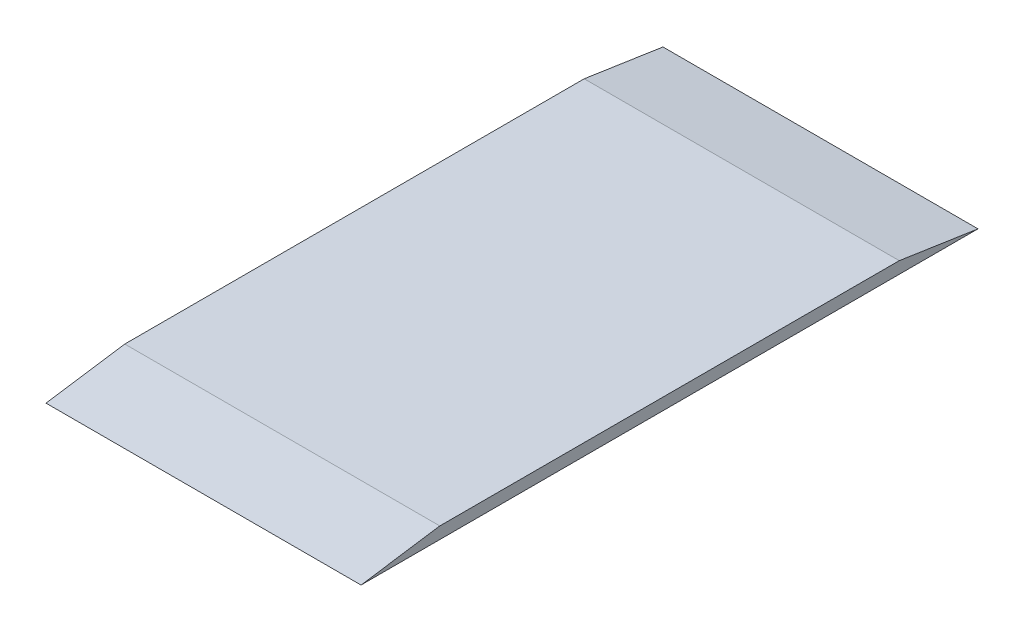
ISO-10303-21;
HEADER;
FILE_DESCRIPTION(('STEP AP214'),'2;1');
FILE_NAME('part.step','',(''),(''),'','','');
FILE_SCHEMA(('AUTOMOTIVE_DESIGN { 1 0 10303 214 1 1 1 1 }'));
ENDSEC;
DATA;
#1=APPLICATION_CONTEXT('core data for automotive mechanical design processes');
#2=APPLICATION_PROTOCOL_DEFINITION('international standard','automotive_design',2000,#1);
#3=PRODUCT_CONTEXT('',#1,'mechanical');
#4=PRODUCT('Part','Part','',(#3));
#5=PRODUCT_RELATED_PRODUCT_CATEGORY('part','',(#4));
#6=PRODUCT_DEFINITION_FORMATION('','',#4);
#7=PRODUCT_DEFINITION_CONTEXT('part definition',#1,'design');
#8=PRODUCT_DEFINITION('design','',#6,#7);
#9=PRODUCT_DEFINITION_SHAPE('','',#8);
#10=(LENGTH_UNIT() NAMED_UNIT(*) SI_UNIT(.MILLI.,.METRE.));
#11=(NAMED_UNIT(*) PLANE_ANGLE_UNIT() SI_UNIT($,.RADIAN.));
#12=(NAMED_UNIT(*) SI_UNIT($,.STERADIAN.) SOLID_ANGLE_UNIT());
#13=UNCERTAINTY_MEASURE_WITH_UNIT(LENGTH_MEASURE(1.E-05),#10,'distance_accuracy_value','');
#14=(GEOMETRIC_REPRESENTATION_CONTEXT(3) GLOBAL_UNCERTAINTY_ASSIGNED_CONTEXT((#13)) GLOBAL_UNIT_ASSIGNED_CONTEXT((#10,
#11,#12)) REPRESENTATION_CONTEXT('',''));
#15=CARTESIAN_POINT('',(0.,0.,0.));
#16=DIRECTION('',(0.,0.,1.));
#17=DIRECTION('',(1.,0.,0.));
#18=AXIS2_PLACEMENT_3D('',#15,#16,#17);
#19=CARTESIAN_POINT('',(12.,0.9,-17.5));
#20=DIRECTION('',(0.,-0.988936352868298,0.148340452930245));
#21=DIRECTION('',(0.,-0.148340452930245,-0.988936352868298));
#22=AXIS2_PLACEMENT_3D('',#19,#20,#21);
#23=PLANE('',#22);
#24=DIRECTION('',(0.,0.148340452930245,0.988936352868297));
#25=VECTOR('',#24,1.);
#26=CARTESIAN_POINT('',(-12.,0.9,-17.5));
#27=LINE('',#26,#25);
#28=CARTESIAN_POINT('',(-12.,0.,-23.5));
#29=VERTEX_POINT('',#28);
#30=CARTESIAN_POINT('',(-12.,0.9,-17.5));
#31=VERTEX_POINT('',#30);
#32=EDGE_CURVE('E100',#29,#31,#27,.T.);
#33=ORIENTED_EDGE('',*,*,#32,.T.);
#34=DIRECTION('',(-1.,0.,0.));
#35=VECTOR('',#34,1.);
#36=CARTESIAN_POINT('',(12.,0.9,-17.5));
#37=LINE('',#36,#35);
#38=CARTESIAN_POINT('',(12.,0.9,-17.5));
#39=VERTEX_POINT('',#38);
#40=EDGE_CURVE('E11',#39,#31,#37,.T.);
#41=ORIENTED_EDGE('',*,*,#40,.F.);
#42=DIRECTION('',(0.,0.148340452930245,0.988936352868297));
#43=VECTOR('',#42,1.);
#44=CARTESIAN_POINT('',(12.,0.9,-17.5));
#45=LINE('',#44,#43);
#46=CARTESIAN_POINT('',(12.,0.,-23.5));
#47=VERTEX_POINT('',#46);
#48=EDGE_CURVE('E88',#47,#39,#45,.T.);
#49=ORIENTED_EDGE('',*,*,#48,.F.);
#50=DIRECTION('',(-1.,0.,0.));
#51=VECTOR('',#50,1.);
#52=CARTESIAN_POINT('',(12.,0.,-23.5));
#53=LINE('',#52,#51);
#54=EDGE_CURVE('E96',#47,#29,#53,.T.);
#55=ORIENTED_EDGE('',*,*,#54,.T.);
#56=EDGE_LOOP('',(#33,#41,#49,#55));
#57=FACE_BOUND('',#56,.T.);
#58=ADVANCED_FACE('F37',(#57),#23,.F.);
#59=CARTESIAN_POINT('',(12.,0.9,17.5));
#60=DIRECTION('',(0.,-1.,0.));
#61=DIRECTION('',(0.,0.,-1.));
#62=AXIS2_PLACEMENT_3D('',#59,#60,#61);
#63=PLANE('',#62);
#64=DIRECTION('',(0.,0.,1.));
#65=VECTOR('',#64,1.);
#66=CARTESIAN_POINT('',(-12.,0.9,17.5));
#67=LINE('',#66,#65);
#68=CARTESIAN_POINT('',(-12.,0.9,17.5));
#69=VERTEX_POINT('',#68);
#70=EDGE_CURVE('E92',#31,#69,#67,.T.);
#71=ORIENTED_EDGE('',*,*,#70,.T.);
#72=DIRECTION('',(-1.,0.,0.));
#73=VECTOR('',#72,1.);
#74=CARTESIAN_POINT('',(12.,0.9,17.5));
#75=LINE('',#74,#73);
#76=CARTESIAN_POINT('',(12.,0.9,17.5));
#77=VERTEX_POINT('',#76);
#78=EDGE_CURVE('E45',#77,#69,#75,.T.);
#79=ORIENTED_EDGE('',*,*,#78,.F.);
#80=DIRECTION('',(0.,0.,1.));
#81=VECTOR('',#80,1.);
#82=CARTESIAN_POINT('',(12.,0.9,17.5));
#83=LINE('',#82,#81);
#84=EDGE_CURVE('E83',#39,#77,#83,.T.);
#85=ORIENTED_EDGE('',*,*,#84,.F.);
#86=ORIENTED_EDGE('',*,*,#40,.T.);
#87=EDGE_LOOP('',(#71,#79,#85,#86));
#88=FACE_BOUND('',#87,.T.);
#89=ADVANCED_FACE('F91',(#88),#63,.F.);
#90=CARTESIAN_POINT('',(12.,0.,23.5));
#91=DIRECTION('',(0.,-0.988936352868298,-0.148340452930245));
#92=DIRECTION('',(0.,0.148340452930245,-0.988936352868298));
#93=AXIS2_PLACEMENT_3D('',#90,#91,#92);
#94=PLANE('',#93);
#95=DIRECTION('',(0.,-0.148340452930245,0.988936352868297));
#96=VECTOR('',#95,1.);
#97=CARTESIAN_POINT('',(-12.,0.,23.5));
#98=LINE('',#97,#96);
#99=CARTESIAN_POINT('',(-12.,0.,23.5));
#100=VERTEX_POINT('',#99);
#101=EDGE_CURVE('E70',#69,#100,#98,.T.);
#102=ORIENTED_EDGE('',*,*,#101,.T.);
#103=DIRECTION('',(-1.,0.,0.));
#104=VECTOR('',#103,1.);
#105=CARTESIAN_POINT('',(12.,0.,23.5));
#106=LINE('',#105,#104);
#107=CARTESIAN_POINT('',(12.,0.,23.5));
#108=VERTEX_POINT('',#107);
#109=EDGE_CURVE('E93',#108,#100,#106,.T.);
#110=ORIENTED_EDGE('',*,*,#109,.F.);
#111=DIRECTION('',(0.,-0.148340452930245,0.988936352868297));
#112=VECTOR('',#111,1.);
#113=CARTESIAN_POINT('',(12.,0.,23.5));
#114=LINE('',#113,#112);
#115=EDGE_CURVE('E86',#77,#108,#114,.T.);
#116=ORIENTED_EDGE('',*,*,#115,.F.);
#117=ORIENTED_EDGE('',*,*,#78,.T.);
#118=EDGE_LOOP('',(#102,#110,#116,#117));
#119=FACE_BOUND('',#118,.T.);
#120=ADVANCED_FACE('F94',(#119),#94,.F.);
#121=CARTESIAN_POINT('',(12.,0.,-23.5));
#122=DIRECTION('',(0.,1.,0.));
#123=DIRECTION('',(0.,0.,1.));
#124=AXIS2_PLACEMENT_3D('',#121,#122,#123);
#125=PLANE('',#124);
#126=DIRECTION('',(0.,0.,-1.));
#127=VECTOR('',#126,1.);
#128=CARTESIAN_POINT('',(-12.,0.,-23.5));
#129=LINE('',#128,#127);
#130=EDGE_CURVE('E76',#100,#29,#129,.T.);
#131=ORIENTED_EDGE('',*,*,#130,.T.);
#132=ORIENTED_EDGE('',*,*,#54,.F.);
#133=DIRECTION('',(0.,0.,-1.));
#134=VECTOR('',#133,1.);
#135=CARTESIAN_POINT('',(12.,0.,-23.5));
#136=LINE('',#135,#134);
#137=EDGE_CURVE('E53',#108,#47,#136,.T.);
#138=ORIENTED_EDGE('',*,*,#137,.F.);
#139=ORIENTED_EDGE('',*,*,#109,.T.);
#140=EDGE_LOOP('',(#131,#132,#138,#139));
#141=FACE_BOUND('',#140,.T.);
#142=ADVANCED_FACE('F107',(#141),#125,.F.);
#143=CARTESIAN_POINT('',(12.,0.,0.));
#144=DIRECTION('',(1.,0.,0.));
#145=DIRECTION('',(0.,0.,-1.));
#146=AXIS2_PLACEMENT_3D('',#143,#144,#145);
#147=PLANE('',#146);
#148=ORIENTED_EDGE('',*,*,#48,.T.);
#149=ORIENTED_EDGE('',*,*,#84,.T.);
#150=ORIENTED_EDGE('',*,*,#115,.T.);
#151=ORIENTED_EDGE('',*,*,#137,.T.);
#152=EDGE_LOOP('',(#148,#149,#150,#151));
#153=FACE_BOUND('',#152,.T.);
#154=ADVANCED_FACE('F84',(#153),#147,.T.);
#155=CARTESIAN_POINT('',(-12.,0.,0.));
#156=DIRECTION('',(1.,0.,0.));
#157=DIRECTION('',(0.,0.,-1.));
#158=AXIS2_PLACEMENT_3D('',#155,#156,#157);
#159=PLANE('',#158);
#160=ORIENTED_EDGE('',*,*,#32,.F.);
#161=ORIENTED_EDGE('',*,*,#130,.F.);
#162=ORIENTED_EDGE('',*,*,#101,.F.);
#163=ORIENTED_EDGE('',*,*,#70,.F.);
#164=EDGE_LOOP('',(#160,#161,#162,#163));
#165=FACE_BOUND('',#164,.T.);
#166=ADVANCED_FACE('F110',(#165),#159,.F.);
#167=CLOSED_SHELL('',(#58,#89,#120,#142,#154,#166));
#168=MANIFOLD_SOLID_BREP('B2',#167);
#169=ADVANCED_BREP_SHAPE_REPRESENTATION('',(#18,#168),#14);
#170=SHAPE_DEFINITION_REPRESENTATION(#9,#169);
ENDSEC;
END-ISO-10303-21;
